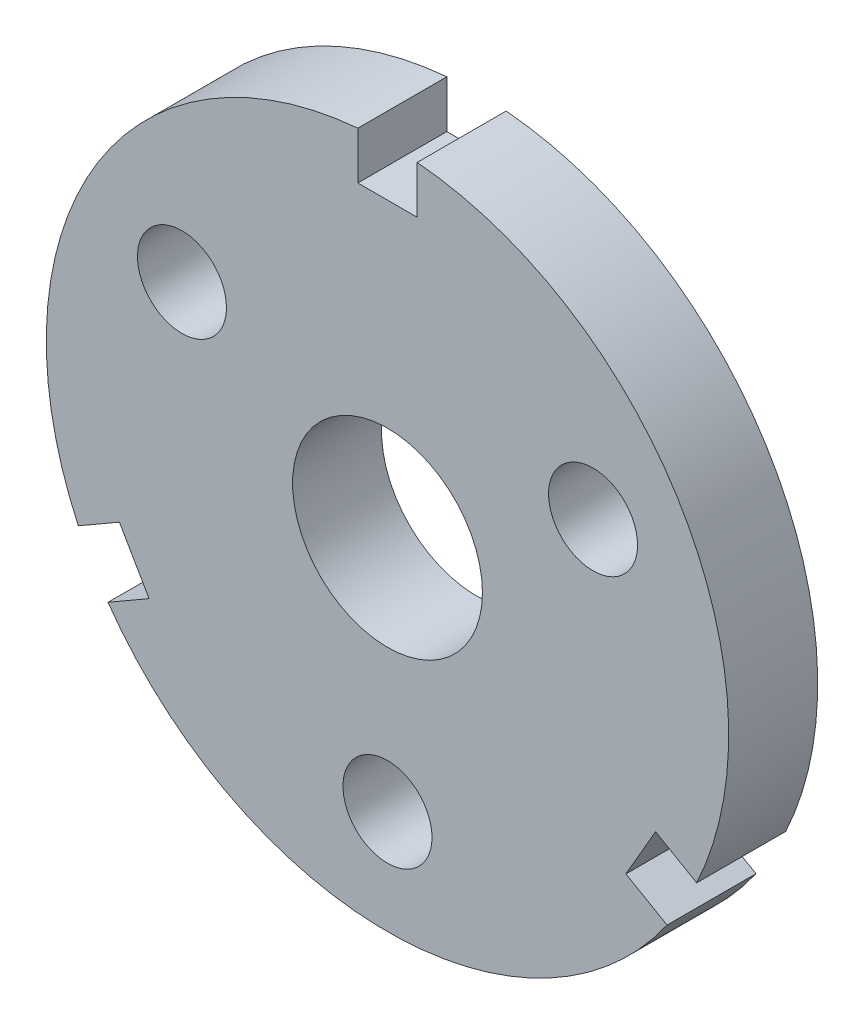
ISO-10303-21;
HEADER;
FILE_DESCRIPTION(('STEP AP214'),'2;1');
FILE_NAME('part.step','',(''),(''),'','','');
FILE_SCHEMA(('AUTOMOTIVE_DESIGN { 1 0 10303 214 1 1 1 1 }'));
ENDSEC;
DATA;
#1=APPLICATION_CONTEXT('core data for automotive mechanical design processes');
#2=APPLICATION_PROTOCOL_DEFINITION('international standard','automotive_design',2000,#1);
#3=PRODUCT_CONTEXT('',#1,'mechanical');
#4=PRODUCT('Part','Part','',(#3));
#5=PRODUCT_RELATED_PRODUCT_CATEGORY('part','',(#4));
#6=PRODUCT_DEFINITION_FORMATION('','',#4);
#7=PRODUCT_DEFINITION_CONTEXT('part definition',#1,'design');
#8=PRODUCT_DEFINITION('design','',#6,#7);
#9=PRODUCT_DEFINITION_SHAPE('','',#8);
#10=(LENGTH_UNIT() NAMED_UNIT(*) SI_UNIT(.MILLI.,.METRE.));
#11=(NAMED_UNIT(*) PLANE_ANGLE_UNIT() SI_UNIT($,.RADIAN.));
#12=(NAMED_UNIT(*) SI_UNIT($,.STERADIAN.) SOLID_ANGLE_UNIT());
#13=UNCERTAINTY_MEASURE_WITH_UNIT(LENGTH_MEASURE(1.E-05),#10,'distance_accuracy_value','');
#14=(GEOMETRIC_REPRESENTATION_CONTEXT(3) GLOBAL_UNCERTAINTY_ASSIGNED_CONTEXT((#13)) GLOBAL_UNIT_ASSIGNED_CONTEXT((#10,
#11,#12)) REPRESENTATION_CONTEXT('',''));
#15=CARTESIAN_POINT('',(0.,0.,0.));
#16=DIRECTION('',(0.,0.,1.));
#17=DIRECTION('',(1.,0.,0.));
#18=AXIS2_PLACEMENT_3D('',#15,#16,#17);
#19=CARTESIAN_POINT('',(0.,0.,15.));
#20=DIRECTION('',(0.,0.,1.));
#21=DIRECTION('',(1.,0.,0.));
#22=AXIS2_PLACEMENT_3D('',#19,#20,#21);
#23=PLANE('',#22);
#24=CARTESIAN_POINT('',(-34.6410161513775,20.0000000000002,15.));
#25=DIRECTION('',(0.,0.,1.));
#26=DIRECTION('',(1.,0.,0.));
#27=AXIS2_PLACEMENT_3D('',#24,#25,#26);
#28=CIRCLE('',#27,7.5);
#29=CARTESIAN_POINT('',(-27.1410161513775,20.0000000000002,15.));
#30=VERTEX_POINT('',#29);
#31=EDGE_CURVE('E297',#30,#30,#28,.T.);
#32=ORIENTED_EDGE('',*,*,#31,.F.);
#33=EDGE_LOOP('',(#32));
#34=FACE_BOUND('',#33,.T.);
#35=CARTESIAN_POINT('',(0.,0.,15.));
#36=DIRECTION('',(0.,0.,1.));
#37=DIRECTION('',(1.,0.,0.));
#38=AXIS2_PLACEMENT_3D('',#35,#36,#37);
#39=CIRCLE('',#38,16.);
#40=CARTESIAN_POINT('',(16.,0.,15.));
#41=VERTEX_POINT('',#40);
#42=EDGE_CURVE('E163',#41,#41,#39,.T.);
#43=ORIENTED_EDGE('',*,*,#42,.F.);
#44=EDGE_LOOP('',(#43));
#45=FACE_BOUND('',#44,.T.);
#46=DIRECTION('',(0.,1.,0.));
#47=VECTOR('',#46,1.);
#48=CARTESIAN_POINT('',(-5.,49.282196186948,15.));
#49=LINE('',#48,#47);
#50=CARTESIAN_POINT('',(-5.,49.282196186948,15.));
#51=VERTEX_POINT('',#50);
#52=CARTESIAN_POINT('',(-4.99999999999999,57.282196186948,15.));
#53=VERTEX_POINT('',#52);
#54=EDGE_CURVE('E183',#51,#53,#49,.T.);
#55=ORIENTED_EDGE('',*,*,#54,.T.);
#56=CARTESIAN_POINT('',(0.,0.,15.));
#57=DIRECTION('',(0.,0.,1.));
#58=DIRECTION('',(1.,0.,0.));
#59=AXIS2_PLACEMENT_3D('',#56,#57,#58);
#60=CIRCLE('',#59,57.5);
#61=CARTESIAN_POINT('',(-52.1078370824611,-24.3109710745519,15.));
#62=VERTEX_POINT('',#61);
#63=EDGE_CURVE('E112',#53,#62,#60,.T.);
#64=ORIENTED_EDGE('',*,*,#63,.T.);
#65=DIRECTION('',(0.866025403784438,0.500000000000001,0.));
#66=VECTOR('',#65,1.);
#67=CARTESIAN_POINT('',(-52.1078370824611,-24.3109710745519,15.));
#68=LINE('',#67,#66);
#69=CARTESIAN_POINT('',(-45.1796338521855,-20.3109710745519,15.));
#70=VERTEX_POINT('',#69);
#71=EDGE_CURVE('E210',#62,#70,#68,.T.);
#72=ORIENTED_EDGE('',*,*,#71,.T.);
#73=DIRECTION('',(0.5,-0.866025403784438,0.));
#74=VECTOR('',#73,1.);
#75=CARTESIAN_POINT('',(-45.1796338521855,-20.3109710745519,15.));
#76=LINE('',#75,#74);
#77=CARTESIAN_POINT('',(-40.1796338521855,-28.9712251123962,15.));
#78=VERTEX_POINT('',#77);
#79=EDGE_CURVE('E227',#70,#78,#76,.T.);
#80=ORIENTED_EDGE('',*,*,#79,.T.);
#81=DIRECTION('',(-0.866025403784438,-0.5,0.));
#82=VECTOR('',#81,1.);
#83=CARTESIAN_POINT('',(-40.1796338521855,-28.9712251123962,15.));
#84=LINE('',#83,#82);
#85=CARTESIAN_POINT('',(-47.1078370824611,-32.9712251123962,15.));
#86=VERTEX_POINT('',#85);
#87=EDGE_CURVE('E226',#78,#86,#84,.T.);
#88=ORIENTED_EDGE('',*,*,#87,.T.);
#89=CARTESIAN_POINT('',(0.,0.,15.));
#90=DIRECTION('',(0.,0.,1.));
#91=DIRECTION('',(1.,0.,0.));
#92=AXIS2_PLACEMENT_3D('',#89,#90,#91);
#93=CIRCLE('',#92,57.5);
#94=CARTESIAN_POINT('',(47.1078370824611,-32.9712251123962,15.));
#95=VERTEX_POINT('',#94);
#96=EDGE_CURVE('E228',#86,#95,#93,.T.);
#97=ORIENTED_EDGE('',*,*,#96,.T.);
#98=DIRECTION('',(-0.866025403784439,0.499999999999999,0.));
#99=VECTOR('',#98,1.);
#100=CARTESIAN_POINT('',(47.1078370824611,-32.9712251123962,15.));
#101=LINE('',#100,#99);
#102=CARTESIAN_POINT('',(40.1796338521856,-28.9712251123962,15.));
#103=VERTEX_POINT('',#102);
#104=EDGE_CURVE('E231',#95,#103,#101,.T.);
#105=ORIENTED_EDGE('',*,*,#104,.T.);
#106=DIRECTION('',(0.5,0.866025403784439,0.));
#107=VECTOR('',#106,1.);
#108=CARTESIAN_POINT('',(40.1796338521856,-28.9712251123962,15.));
#109=LINE('',#108,#107);
#110=CARTESIAN_POINT('',(45.1796338521856,-20.3109710745518,15.));
#111=VERTEX_POINT('',#110);
#112=EDGE_CURVE('E240',#103,#111,#109,.T.);
#113=ORIENTED_EDGE('',*,*,#112,.T.);
#114=DIRECTION('',(0.866025403784439,-0.5,0.));
#115=VECTOR('',#114,1.);
#116=CARTESIAN_POINT('',(45.1796338521856,-20.3109710745518,15.));
#117=LINE('',#116,#115);
#118=CARTESIAN_POINT('',(52.1078370824611,-24.3109710745518,15.));
#119=VERTEX_POINT('',#118);
#120=EDGE_CURVE('E145',#111,#119,#117,.T.);
#121=ORIENTED_EDGE('',*,*,#120,.T.);
#122=CARTESIAN_POINT('',(0.,0.,15.));
#123=DIRECTION('',(0.,0.,1.));
#124=DIRECTION('',(1.,0.,0.));
#125=AXIS2_PLACEMENT_3D('',#122,#123,#124);
#126=CIRCLE('',#125,57.5);
#127=CARTESIAN_POINT('',(5.,57.282196186948,15.));
#128=VERTEX_POINT('',#127);
#129=EDGE_CURVE('E136',#119,#128,#126,.T.);
#130=ORIENTED_EDGE('',*,*,#129,.T.);
#131=DIRECTION('',(0.,-1.,0.));
#132=VECTOR('',#131,1.);
#133=CARTESIAN_POINT('',(5.,57.282196186948,15.));
#134=LINE('',#133,#132);
#135=CARTESIAN_POINT('',(5.,49.282196186948,15.));
#136=VERTEX_POINT('',#135);
#137=EDGE_CURVE('E139',#128,#136,#134,.T.);
#138=ORIENTED_EDGE('',*,*,#137,.T.);
#139=DIRECTION('',(-1.,0.,0.));
#140=VECTOR('',#139,1.);
#141=CARTESIAN_POINT('',(5.,49.282196186948,15.));
#142=LINE('',#141,#140);
#143=EDGE_CURVE('E57',#136,#51,#142,.T.);
#144=ORIENTED_EDGE('',*,*,#143,.T.);
#145=EDGE_LOOP('',(#55,#64,#72,#80,#88,#97,#105,#113,#121,#130,#138,#144));
#146=FACE_BOUND('',#145,.T.);
#147=CARTESIAN_POINT('',(0.,-40.,15.));
#148=DIRECTION('',(0.,0.,1.));
#149=DIRECTION('',(1.,0.,0.));
#150=AXIS2_PLACEMENT_3D('',#147,#148,#149);
#151=CIRCLE('',#150,7.5);
#152=CARTESIAN_POINT('',(7.5,-40.,15.));
#153=VERTEX_POINT('',#152);
#154=EDGE_CURVE('E301',#153,#153,#151,.T.);
#155=ORIENTED_EDGE('',*,*,#154,.F.);
#156=EDGE_LOOP('',(#155));
#157=FACE_BOUND('',#156,.T.);
#158=CARTESIAN_POINT('',(34.6410161513777,19.9999999999997,15.));
#159=DIRECTION('',(0.,0.,1.));
#160=DIRECTION('',(1.,0.,0.));
#161=AXIS2_PLACEMENT_3D('',#158,#159,#160);
#162=CIRCLE('',#161,7.5);
#163=CARTESIAN_POINT('',(42.1410161513777,19.9999999999997,15.));
#164=VERTEX_POINT('',#163);
#165=EDGE_CURVE('E289',#164,#164,#162,.T.);
#166=ORIENTED_EDGE('',*,*,#165,.F.);
#167=EDGE_LOOP('',(#166));
#168=FACE_BOUND('',#167,.T.);
#169=ADVANCED_FACE('F39',(#34,#45,#146,#157,#168),#23,.T.);
#170=CARTESIAN_POINT('',(0.,0.,0.));
#171=DIRECTION('',(0.,0.,1.));
#172=DIRECTION('',(1.,0.,0.));
#173=AXIS2_PLACEMENT_3D('',#170,#171,#172);
#174=PLANE('',#173);
#175=DIRECTION('',(0.,1.,0.));
#176=VECTOR('',#175,1.);
#177=CARTESIAN_POINT('',(-5.,49.282196186948,0.));
#178=LINE('',#177,#176);
#179=CARTESIAN_POINT('',(-5.,49.282196186948,0.));
#180=VERTEX_POINT('',#179);
#181=CARTESIAN_POINT('',(-4.99999999999999,57.282196186948,0.));
#182=VERTEX_POINT('',#181);
#183=EDGE_CURVE('E158',#180,#182,#178,.T.);
#184=ORIENTED_EDGE('',*,*,#183,.F.);
#185=DIRECTION('',(-1.,0.,0.));
#186=VECTOR('',#185,1.);
#187=CARTESIAN_POINT('',(5.,49.282196186948,0.));
#188=LINE('',#187,#186);
#189=CARTESIAN_POINT('',(5.,49.282196186948,0.));
#190=VERTEX_POINT('',#189);
#191=EDGE_CURVE('E104',#190,#180,#188,.T.);
#192=ORIENTED_EDGE('',*,*,#191,.F.);
#193=DIRECTION('',(0.,-1.,0.));
#194=VECTOR('',#193,1.);
#195=CARTESIAN_POINT('',(5.,57.282196186948,0.));
#196=LINE('',#195,#194);
#197=CARTESIAN_POINT('',(5.,57.282196186948,0.));
#198=VERTEX_POINT('',#197);
#199=EDGE_CURVE('E100',#198,#190,#196,.T.);
#200=ORIENTED_EDGE('',*,*,#199,.F.);
#201=CARTESIAN_POINT('',(0.,0.,0.));
#202=DIRECTION('',(0.,0.,1.));
#203=DIRECTION('',(1.,0.,0.));
#204=AXIS2_PLACEMENT_3D('',#201,#202,#203);
#205=CIRCLE('',#204,57.5);
#206=CARTESIAN_POINT('',(52.1078370824611,-24.3109710745518,0.));
#207=VERTEX_POINT('',#206);
#208=EDGE_CURVE('E148',#207,#198,#205,.T.);
#209=ORIENTED_EDGE('',*,*,#208,.F.);
#210=DIRECTION('',(0.866025403784439,-0.5,0.));
#211=VECTOR('',#210,1.);
#212=CARTESIAN_POINT('',(45.1796338521856,-20.3109710745518,0.));
#213=LINE('',#212,#211);
#214=CARTESIAN_POINT('',(45.1796338521856,-20.3109710745518,0.));
#215=VERTEX_POINT('',#214);
#216=EDGE_CURVE('E178',#215,#207,#213,.T.);
#217=ORIENTED_EDGE('',*,*,#216,.F.);
#218=DIRECTION('',(0.5,0.866025403784439,0.));
#219=VECTOR('',#218,1.);
#220=CARTESIAN_POINT('',(40.1796338521856,-28.9712251123962,0.));
#221=LINE('',#220,#219);
#222=CARTESIAN_POINT('',(40.1796338521856,-28.9712251123962,0.));
#223=VERTEX_POINT('',#222);
#224=EDGE_CURVE('E176',#223,#215,#221,.T.);
#225=ORIENTED_EDGE('',*,*,#224,.F.);
#226=DIRECTION('',(-0.866025403784439,0.499999999999999,0.));
#227=VECTOR('',#226,1.);
#228=CARTESIAN_POINT('',(47.1078370824611,-32.9712251123962,0.));
#229=LINE('',#228,#227);
#230=CARTESIAN_POINT('',(47.1078370824611,-32.9712251123962,0.));
#231=VERTEX_POINT('',#230);
#232=EDGE_CURVE('E174',#231,#223,#229,.T.);
#233=ORIENTED_EDGE('',*,*,#232,.F.);
#234=CARTESIAN_POINT('',(0.,0.,0.));
#235=DIRECTION('',(0.,0.,1.));
#236=DIRECTION('',(1.,0.,0.));
#237=AXIS2_PLACEMENT_3D('',#234,#235,#236);
#238=CIRCLE('',#237,57.5);
#239=CARTESIAN_POINT('',(-47.1078370824611,-32.9712251123962,0.));
#240=VERTEX_POINT('',#239);
#241=EDGE_CURVE('E175',#240,#231,#238,.T.);
#242=ORIENTED_EDGE('',*,*,#241,.F.);
#243=DIRECTION('',(-0.866025403784438,-0.5,0.));
#244=VECTOR('',#243,1.);
#245=CARTESIAN_POINT('',(-40.1796338521855,-28.9712251123962,0.));
#246=LINE('',#245,#244);
#247=CARTESIAN_POINT('',(-40.1796338521855,-28.9712251123962,0.));
#248=VERTEX_POINT('',#247);
#249=EDGE_CURVE('E169',#248,#240,#246,.T.);
#250=ORIENTED_EDGE('',*,*,#249,.F.);
#251=DIRECTION('',(0.5,-0.866025403784438,0.));
#252=VECTOR('',#251,1.);
#253=CARTESIAN_POINT('',(-45.1796338521855,-20.3109710745519,0.));
#254=LINE('',#253,#252);
#255=CARTESIAN_POINT('',(-45.1796338521855,-20.3109710745519,0.));
#256=VERTEX_POINT('',#255);
#257=EDGE_CURVE('E166',#256,#248,#254,.T.);
#258=ORIENTED_EDGE('',*,*,#257,.F.);
#259=DIRECTION('',(0.866025403784438,0.500000000000001,0.));
#260=VECTOR('',#259,1.);
#261=CARTESIAN_POINT('',(-52.1078370824611,-24.3109710745519,0.));
#262=LINE('',#261,#260);
#263=CARTESIAN_POINT('',(-52.1078370824611,-24.3109710745519,0.));
#264=VERTEX_POINT('',#263);
#265=EDGE_CURVE('E168',#264,#256,#262,.T.);
#266=ORIENTED_EDGE('',*,*,#265,.F.);
#267=CARTESIAN_POINT('',(0.,0.,0.));
#268=DIRECTION('',(0.,0.,1.));
#269=DIRECTION('',(1.,0.,0.));
#270=AXIS2_PLACEMENT_3D('',#267,#268,#269);
#271=CIRCLE('',#270,57.5);
#272=EDGE_CURVE('E164',#182,#264,#271,.T.);
#273=ORIENTED_EDGE('',*,*,#272,.F.);
#274=EDGE_LOOP('',(#184,#192,#200,#209,#217,#225,#233,#242,#250,#258,#266,#273));
#275=FACE_BOUND('',#274,.T.);
#276=CARTESIAN_POINT('',(0.,0.,0.));
#277=DIRECTION('',(0.,0.,1.));
#278=DIRECTION('',(1.,0.,0.));
#279=AXIS2_PLACEMENT_3D('',#276,#277,#278);
#280=CIRCLE('',#279,16.);
#281=CARTESIAN_POINT('',(16.,0.,0.));
#282=VERTEX_POINT('',#281);
#283=EDGE_CURVE('E308',#282,#282,#280,.T.);
#284=ORIENTED_EDGE('',*,*,#283,.T.);
#285=EDGE_LOOP('',(#284));
#286=FACE_BOUND('',#285,.T.);
#287=CARTESIAN_POINT('',(0.,-40.,0.));
#288=DIRECTION('',(0.,0.,1.));
#289=DIRECTION('',(1.,0.,0.));
#290=AXIS2_PLACEMENT_3D('',#287,#288,#289);
#291=CIRCLE('',#290,7.5);
#292=CARTESIAN_POINT('',(7.5,-40.,0.));
#293=VERTEX_POINT('',#292);
#294=EDGE_CURVE('E300',#293,#293,#291,.T.);
#295=ORIENTED_EDGE('',*,*,#294,.T.);
#296=EDGE_LOOP('',(#295));
#297=FACE_BOUND('',#296,.T.);
#298=CARTESIAN_POINT('',(-34.6410161513775,20.0000000000002,0.));
#299=DIRECTION('',(0.,0.,1.));
#300=DIRECTION('',(1.,0.,0.));
#301=AXIS2_PLACEMENT_3D('',#298,#299,#300);
#302=CIRCLE('',#301,7.5);
#303=CARTESIAN_POINT('',(-27.1410161513775,20.0000000000002,0.));
#304=VERTEX_POINT('',#303);
#305=EDGE_CURVE('E294',#304,#304,#302,.T.);
#306=ORIENTED_EDGE('',*,*,#305,.T.);
#307=EDGE_LOOP('',(#306));
#308=FACE_BOUND('',#307,.T.);
#309=CARTESIAN_POINT('',(34.6410161513777,19.9999999999997,0.));
#310=DIRECTION('',(0.,0.,1.));
#311=DIRECTION('',(1.,0.,0.));
#312=AXIS2_PLACEMENT_3D('',#309,#310,#311);
#313=CIRCLE('',#312,7.5);
#314=CARTESIAN_POINT('',(42.1410161513777,19.9999999999997,0.));
#315=VERTEX_POINT('',#314);
#316=EDGE_CURVE('E292',#315,#315,#313,.T.);
#317=ORIENTED_EDGE('',*,*,#316,.T.);
#318=EDGE_LOOP('',(#317));
#319=FACE_BOUND('',#318,.T.);
#320=ADVANCED_FACE('F215',(#275,#286,#297,#308,#319),#174,.F.);
#321=CARTESIAN_POINT('',(-5.,49.282196186948,15.));
#322=DIRECTION('',(-1.,0.,0.));
#323=DIRECTION('',(0.,-1.,0.));
#324=AXIS2_PLACEMENT_3D('',#321,#322,#323);
#325=PLANE('',#324);
#326=ORIENTED_EDGE('',*,*,#183,.T.);
#327=DIRECTION('',(0.,0.,-1.));
#328=VECTOR('',#327,1.);
#329=CARTESIAN_POINT('',(-4.99999999999999,57.282196186948,15.));
#330=LINE('',#329,#328);
#331=EDGE_CURVE('E11',#53,#182,#330,.T.);
#332=ORIENTED_EDGE('',*,*,#331,.F.);
#333=ORIENTED_EDGE('',*,*,#54,.F.);
#334=DIRECTION('',(0.,0.,-1.));
#335=VECTOR('',#334,1.);
#336=CARTESIAN_POINT('',(-5.,49.282196186948,15.));
#337=LINE('',#336,#335);
#338=EDGE_CURVE('E157',#51,#180,#337,.T.);
#339=ORIENTED_EDGE('',*,*,#338,.T.);
#340=EDGE_LOOP('',(#326,#332,#333,#339));
#341=FACE_BOUND('',#340,.T.);
#342=ADVANCED_FACE('F41',(#341),#325,.F.);
#343=CARTESIAN_POINT('',(0.,0.,15.));
#344=DIRECTION('',(0.,0.,-1.));
#345=DIRECTION('',(-1.,0.,0.));
#346=AXIS2_PLACEMENT_3D('',#343,#344,#345);
#347=CYLINDRICAL_SURFACE('',#346,57.5);
#348=ORIENTED_EDGE('',*,*,#272,.T.);
#349=DIRECTION('',(0.,0.,-1.));
#350=VECTOR('',#349,1.);
#351=CARTESIAN_POINT('',(-52.1078370824611,-24.3109710745519,15.));
#352=LINE('',#351,#350);
#353=EDGE_CURVE('E48',#62,#264,#352,.T.);
#354=ORIENTED_EDGE('',*,*,#353,.F.);
#355=ORIENTED_EDGE('',*,*,#63,.F.);
#356=ORIENTED_EDGE('',*,*,#331,.T.);
#357=EDGE_LOOP('',(#348,#354,#355,#356));
#358=FACE_BOUND('',#357,.T.);
#359=ADVANCED_FACE('F418',(#358),#347,.T.);
#360=CARTESIAN_POINT('',(-52.1078370824611,-24.3109710745519,15.));
#361=DIRECTION('',(-0.500000000000001,0.866025403784438,0.));
#362=DIRECTION('',(-0.866025403784438,-0.500000000000001,0.));
#363=AXIS2_PLACEMENT_3D('',#360,#361,#362);
#364=PLANE('',#363);
#365=ORIENTED_EDGE('',*,*,#265,.T.);
#366=DIRECTION('',(0.,0.,-1.));
#367=VECTOR('',#366,1.);
#368=CARTESIAN_POINT('',(-45.1796338521855,-20.3109710745519,15.));
#369=LINE('',#368,#367);
#370=EDGE_CURVE('E205',#70,#256,#369,.T.);
#371=ORIENTED_EDGE('',*,*,#370,.F.);
#372=ORIENTED_EDGE('',*,*,#71,.F.);
#373=ORIENTED_EDGE('',*,*,#353,.T.);
#374=EDGE_LOOP('',(#365,#371,#372,#373));
#375=FACE_BOUND('',#374,.T.);
#376=ADVANCED_FACE('F209',(#375),#364,.F.);
#377=CARTESIAN_POINT('',(-45.1796338521855,-20.3109710745519,15.));
#378=DIRECTION('',(0.866025403784438,0.5,0.));
#379=DIRECTION('',(-0.5,0.866025403784438,0.));
#380=AXIS2_PLACEMENT_3D('',#377,#378,#379);
#381=PLANE('',#380);
#382=ORIENTED_EDGE('',*,*,#257,.T.);
#383=DIRECTION('',(0.,0.,-1.));
#384=VECTOR('',#383,1.);
#385=CARTESIAN_POINT('',(-40.1796338521855,-28.9712251123962,15.));
#386=LINE('',#385,#384);
#387=EDGE_CURVE('E198',#78,#248,#386,.T.);
#388=ORIENTED_EDGE('',*,*,#387,.F.);
#389=ORIENTED_EDGE('',*,*,#79,.F.);
#390=ORIENTED_EDGE('',*,*,#370,.T.);
#391=EDGE_LOOP('',(#382,#388,#389,#390));
#392=FACE_BOUND('',#391,.T.);
#393=ADVANCED_FACE('F217',(#392),#381,.F.);
#394=CARTESIAN_POINT('',(-40.1796338521855,-28.9712251123962,15.));
#395=DIRECTION('',(0.5,-0.866025403784438,0.));
#396=DIRECTION('',(0.866025403784439,0.5,0.));
#397=AXIS2_PLACEMENT_3D('',#394,#395,#396);
#398=PLANE('',#397);
#399=ORIENTED_EDGE('',*,*,#249,.T.);
#400=DIRECTION('',(0.,0.,-1.));
#401=VECTOR('',#400,1.);
#402=CARTESIAN_POINT('',(-47.1078370824611,-32.9712251123962,15.));
#403=LINE('',#402,#401);
#404=EDGE_CURVE('E196',#86,#240,#403,.T.);
#405=ORIENTED_EDGE('',*,*,#404,.F.);
#406=ORIENTED_EDGE('',*,*,#87,.F.);
#407=ORIENTED_EDGE('',*,*,#387,.T.);
#408=EDGE_LOOP('',(#399,#405,#406,#407));
#409=FACE_BOUND('',#408,.T.);
#410=ADVANCED_FACE('F222',(#409),#398,.F.);
#411=CARTESIAN_POINT('',(0.,0.,15.));
#412=DIRECTION('',(0.,0.,-1.));
#413=DIRECTION('',(-1.,0.,0.));
#414=AXIS2_PLACEMENT_3D('',#411,#412,#413);
#415=CYLINDRICAL_SURFACE('',#414,57.5);
#416=ORIENTED_EDGE('',*,*,#241,.T.);
#417=DIRECTION('',(0.,0.,-1.));
#418=VECTOR('',#417,1.);
#419=CARTESIAN_POINT('',(47.1078370824611,-32.9712251123962,15.));
#420=LINE('',#419,#418);
#421=EDGE_CURVE('E194',#95,#231,#420,.T.);
#422=ORIENTED_EDGE('',*,*,#421,.F.);
#423=ORIENTED_EDGE('',*,*,#96,.F.);
#424=ORIENTED_EDGE('',*,*,#404,.T.);
#425=EDGE_LOOP('',(#416,#422,#423,#424));
#426=FACE_BOUND('',#425,.T.);
#427=ADVANCED_FACE('F383',(#426),#415,.T.);
#428=CARTESIAN_POINT('',(47.1078370824611,-32.9712251123962,15.));
#429=DIRECTION('',(-0.499999999999999,-0.866025403784439,0.));
#430=DIRECTION('',(0.866025403784439,-0.499999999999999,0.));
#431=AXIS2_PLACEMENT_3D('',#428,#429,#430);
#432=PLANE('',#431);
#433=ORIENTED_EDGE('',*,*,#232,.T.);
#434=DIRECTION('',(0.,0.,-1.));
#435=VECTOR('',#434,1.);
#436=CARTESIAN_POINT('',(40.1796338521856,-28.9712251123962,15.));
#437=LINE('',#436,#435);
#438=EDGE_CURVE('E189',#103,#223,#437,.T.);
#439=ORIENTED_EDGE('',*,*,#438,.F.);
#440=ORIENTED_EDGE('',*,*,#104,.F.);
#441=ORIENTED_EDGE('',*,*,#421,.T.);
#442=EDGE_LOOP('',(#433,#439,#440,#441));
#443=FACE_BOUND('',#442,.T.);
#444=ADVANCED_FACE('F376',(#443),#432,.F.);
#445=CARTESIAN_POINT('',(40.1796338521856,-28.9712251123962,15.));
#446=DIRECTION('',(-0.866025403784439,0.5,0.));
#447=DIRECTION('',(-0.5,-0.866025403784439,0.));
#448=AXIS2_PLACEMENT_3D('',#445,#446,#447);
#449=PLANE('',#448);
#450=ORIENTED_EDGE('',*,*,#224,.T.);
#451=DIRECTION('',(0.,0.,-1.));
#452=VECTOR('',#451,1.);
#453=CARTESIAN_POINT('',(45.1796338521856,-20.3109710745518,15.));
#454=LINE('',#453,#452);
#455=EDGE_CURVE('E190',#111,#215,#454,.T.);
#456=ORIENTED_EDGE('',*,*,#455,.F.);
#457=ORIENTED_EDGE('',*,*,#112,.F.);
#458=ORIENTED_EDGE('',*,*,#438,.T.);
#459=EDGE_LOOP('',(#450,#456,#457,#458));
#460=FACE_BOUND('',#459,.T.);
#461=ADVANCED_FACE('F244',(#460),#449,.F.);
#462=CARTESIAN_POINT('',(45.1796338521856,-20.3109710745518,15.));
#463=DIRECTION('',(0.5,0.866025403784438,0.));
#464=DIRECTION('',(-0.866025403784439,0.5,0.));
#465=AXIS2_PLACEMENT_3D('',#462,#463,#464);
#466=PLANE('',#465);
#467=ORIENTED_EDGE('',*,*,#216,.T.);
#468=DIRECTION('',(0.,0.,-1.));
#469=VECTOR('',#468,1.);
#470=CARTESIAN_POINT('',(52.1078370824611,-24.3109710745518,15.));
#471=LINE('',#470,#469);
#472=EDGE_CURVE('E151',#119,#207,#471,.T.);
#473=ORIENTED_EDGE('',*,*,#472,.F.);
#474=ORIENTED_EDGE('',*,*,#120,.F.);
#475=ORIENTED_EDGE('',*,*,#455,.T.);
#476=EDGE_LOOP('',(#467,#473,#474,#475));
#477=FACE_BOUND('',#476,.T.);
#478=ADVANCED_FACE('F250',(#477),#466,.F.);
#479=CARTESIAN_POINT('',(0.,0.,15.));
#480=DIRECTION('',(0.,0.,-1.));
#481=DIRECTION('',(-1.,0.,0.));
#482=AXIS2_PLACEMENT_3D('',#479,#480,#481);
#483=CYLINDRICAL_SURFACE('',#482,57.5);
#484=ORIENTED_EDGE('',*,*,#208,.T.);
#485=DIRECTION('',(0.,0.,-1.));
#486=VECTOR('',#485,1.);
#487=CARTESIAN_POINT('',(5.,57.282196186948,15.));
#488=LINE('',#487,#486);
#489=EDGE_CURVE('E150',#128,#198,#488,.T.);
#490=ORIENTED_EDGE('',*,*,#489,.F.);
#491=ORIENTED_EDGE('',*,*,#129,.F.);
#492=ORIENTED_EDGE('',*,*,#472,.T.);
#493=EDGE_LOOP('',(#484,#490,#491,#492));
#494=FACE_BOUND('',#493,.T.);
#495=ADVANCED_FACE('F149',(#494),#483,.T.);
#496=CARTESIAN_POINT('',(5.,57.282196186948,15.));
#497=DIRECTION('',(1.,0.,0.));
#498=DIRECTION('',(0.,1.,0.));
#499=AXIS2_PLACEMENT_3D('',#496,#497,#498);
#500=PLANE('',#499);
#501=ORIENTED_EDGE('',*,*,#199,.T.);
#502=DIRECTION('',(0.,0.,-1.));
#503=VECTOR('',#502,1.);
#504=CARTESIAN_POINT('',(5.,49.282196186948,15.));
#505=LINE('',#504,#503);
#506=EDGE_CURVE('E152',#136,#190,#505,.T.);
#507=ORIENTED_EDGE('',*,*,#506,.F.);
#508=ORIENTED_EDGE('',*,*,#137,.F.);
#509=ORIENTED_EDGE('',*,*,#489,.T.);
#510=EDGE_LOOP('',(#501,#507,#508,#509));
#511=FACE_BOUND('',#510,.T.);
#512=ADVANCED_FACE('F153',(#511),#500,.F.);
#513=CARTESIAN_POINT('',(5.,49.282196186948,15.));
#514=DIRECTION('',(0.,-1.,0.));
#515=DIRECTION('',(0.,0.,-1.));
#516=AXIS2_PLACEMENT_3D('',#513,#514,#515);
#517=PLANE('',#516);
#518=ORIENTED_EDGE('',*,*,#191,.T.);
#519=ORIENTED_EDGE('',*,*,#338,.F.);
#520=ORIENTED_EDGE('',*,*,#143,.F.);
#521=ORIENTED_EDGE('',*,*,#506,.T.);
#522=EDGE_LOOP('',(#518,#519,#520,#521));
#523=FACE_BOUND('',#522,.T.);
#524=ADVANCED_FACE('F251',(#523),#517,.F.);
#525=CARTESIAN_POINT('',(0.,0.,15.));
#526=DIRECTION('',(0.,0.,-1.));
#527=DIRECTION('',(-1.,0.,0.));
#528=AXIS2_PLACEMENT_3D('',#525,#526,#527);
#529=CYLINDRICAL_SURFACE('',#528,16.);
#530=ORIENTED_EDGE('',*,*,#42,.T.);
#531=EDGE_LOOP('',(#530));
#532=FACE_BOUND('',#531,.T.);
#533=ORIENTED_EDGE('',*,*,#283,.F.);
#534=EDGE_LOOP('',(#533));
#535=FACE_BOUND('',#534,.T.);
#536=ADVANCED_FACE('F254',(#532,#535),#529,.F.);
#537=CARTESIAN_POINT('',(0.,-40.,15.));
#538=DIRECTION('',(0.,0.,-1.));
#539=DIRECTION('',(-1.,0.,0.));
#540=AXIS2_PLACEMENT_3D('',#537,#538,#539);
#541=CYLINDRICAL_SURFACE('',#540,7.5);
#542=ORIENTED_EDGE('',*,*,#154,.T.);
#543=EDGE_LOOP('',(#542));
#544=FACE_BOUND('',#543,.T.);
#545=ORIENTED_EDGE('',*,*,#294,.F.);
#546=EDGE_LOOP('',(#545));
#547=FACE_BOUND('',#546,.T.);
#548=ADVANCED_FACE('F260',(#544,#547),#541,.F.);
#549=CARTESIAN_POINT('',(-34.6410161513775,20.0000000000002,15.));
#550=DIRECTION('',(0.,0.,-1.));
#551=DIRECTION('',(-1.,0.,0.));
#552=AXIS2_PLACEMENT_3D('',#549,#550,#551);
#553=CYLINDRICAL_SURFACE('',#552,7.5);
#554=ORIENTED_EDGE('',*,*,#31,.T.);
#555=EDGE_LOOP('',(#554));
#556=FACE_BOUND('',#555,.T.);
#557=ORIENTED_EDGE('',*,*,#305,.F.);
#558=EDGE_LOOP('',(#557));
#559=FACE_BOUND('',#558,.T.);
#560=ADVANCED_FACE('F274',(#556,#559),#553,.F.);
#561=CARTESIAN_POINT('',(34.6410161513777,19.9999999999997,15.));
#562=DIRECTION('',(0.,0.,-1.));
#563=DIRECTION('',(-1.,0.,0.));
#564=AXIS2_PLACEMENT_3D('',#561,#562,#563);
#565=CYLINDRICAL_SURFACE('',#564,7.5);
#566=ORIENTED_EDGE('',*,*,#165,.T.);
#567=EDGE_LOOP('',(#566));
#568=FACE_BOUND('',#567,.T.);
#569=ORIENTED_EDGE('',*,*,#316,.F.);
#570=EDGE_LOOP('',(#569));
#571=FACE_BOUND('',#570,.T.);
#572=ADVANCED_FACE('F278',(#568,#571),#565,.F.);
#573=CLOSED_SHELL('',(#169,#320,#342,#359,#376,#393,#410,#427,#444,#461,#478,#495,#512,#524,
#536,#548,#560,#572));
#574=MANIFOLD_SOLID_BREP('B2',#573);
#575=ADVANCED_BREP_SHAPE_REPRESENTATION('',(#18,#574),#14);
#576=SHAPE_DEFINITION_REPRESENTATION(#9,#575);
ENDSEC;
END-ISO-10303-21;
